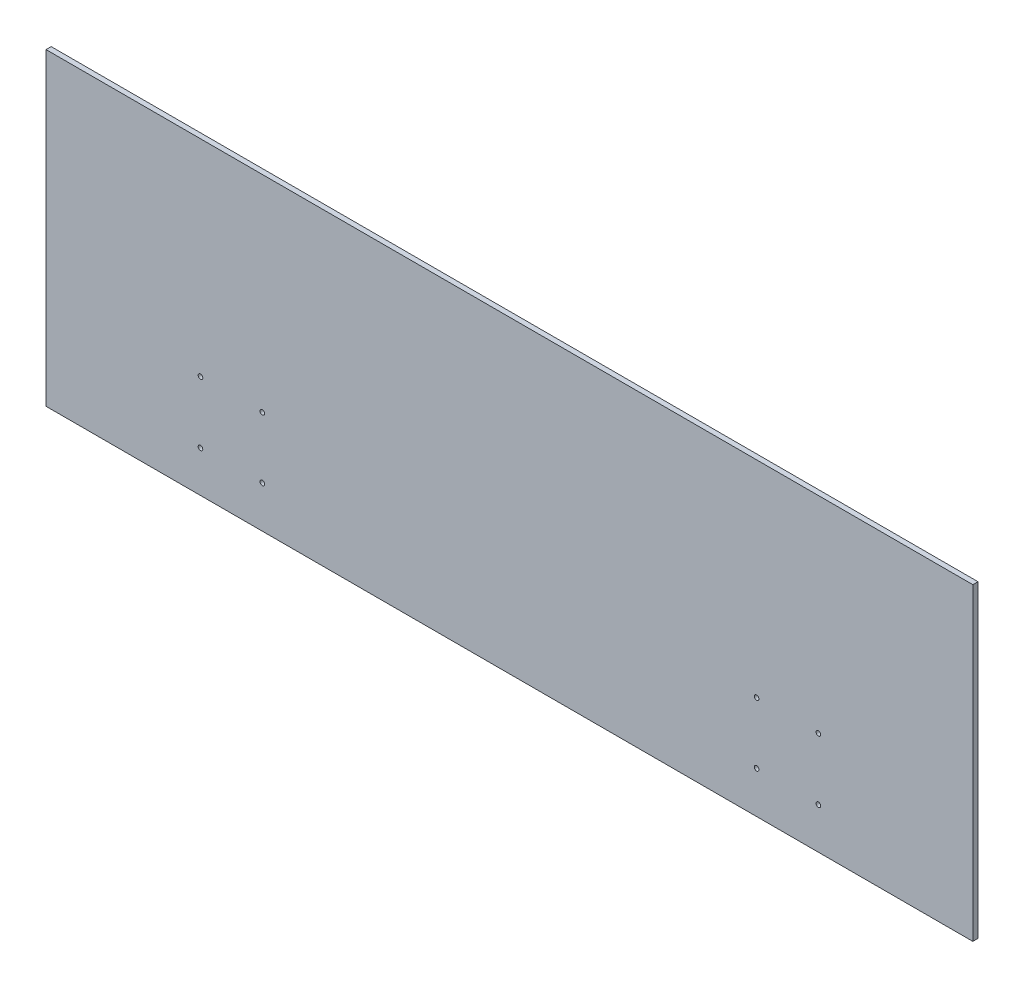
ISO-10303-21;
HEADER;
FILE_DESCRIPTION(('STEP AP214'),'2;1');
FILE_NAME('part.step','',(''),(''),'','','');
FILE_SCHEMA(('AUTOMOTIVE_DESIGN { 1 0 10303 214 1 1 1 1 }'));
ENDSEC;
DATA;
#1=APPLICATION_CONTEXT('core data for automotive mechanical design processes');
#2=APPLICATION_PROTOCOL_DEFINITION('international standard','automotive_design',2000,#1);
#3=PRODUCT_CONTEXT('',#1,'mechanical');
#4=PRODUCT('Part','Part','',(#3));
#5=PRODUCT_RELATED_PRODUCT_CATEGORY('part','',(#4));
#6=PRODUCT_DEFINITION_FORMATION('','',#4);
#7=PRODUCT_DEFINITION_CONTEXT('part definition',#1,'design');
#8=PRODUCT_DEFINITION('design','',#6,#7);
#9=PRODUCT_DEFINITION_SHAPE('','',#8);
#10=(LENGTH_UNIT() NAMED_UNIT(*) SI_UNIT(.MILLI.,.METRE.));
#11=(NAMED_UNIT(*) PLANE_ANGLE_UNIT() SI_UNIT($,.RADIAN.));
#12=(NAMED_UNIT(*) SI_UNIT($,.STERADIAN.) SOLID_ANGLE_UNIT());
#13=UNCERTAINTY_MEASURE_WITH_UNIT(LENGTH_MEASURE(1.E-05),#10,'distance_accuracy_value','');
#14=(GEOMETRIC_REPRESENTATION_CONTEXT(3) GLOBAL_UNCERTAINTY_ASSIGNED_CONTEXT((#13)) GLOBAL_UNIT_ASSIGNED_CONTEXT((#10,
#11,#12)) REPRESENTATION_CONTEXT('',''));
#15=CARTESIAN_POINT('',(0.,0.,0.));
#16=DIRECTION('',(0.,0.,1.));
#17=DIRECTION('',(1.,0.,0.));
#18=AXIS2_PLACEMENT_3D('',#15,#16,#17);
#19=CARTESIAN_POINT('',(0.,0.,5.));
#20=DIRECTION('',(0.,0.,1.));
#21=DIRECTION('',(1.,0.,0.));
#22=AXIS2_PLACEMENT_3D('',#19,#20,#21);
#23=PLANE('',#22);
#24=CARTESIAN_POINT('',(393.736654804271,-7.02846975088967,5.));
#25=DIRECTION('',(0.,0.,1.));
#26=DIRECTION('',(-1.,0.,0.));
#27=AXIS2_PLACEMENT_3D('',#24,#25,#26);
#28=CIRCLE('',#27,2.25000000000001);
#29=CARTESIAN_POINT('',(391.486654804271,-7.02846975088967,5.));
#30=VERTEX_POINT('',#29);
#31=EDGE_CURVE('E148',#30,#30,#28,.T.);
#32=ORIENTED_EDGE('',*,*,#31,.F.);
#33=EDGE_LOOP('',(#32));
#34=FACE_BOUND('',#33,.T.);
#35=CARTESIAN_POINT('',(453.736654804271,-67.0284697508897,5.));
#36=DIRECTION('',(0.,0.,1.));
#37=DIRECTION('',(-1.,0.,0.));
#38=AXIS2_PLACEMENT_3D('',#35,#36,#37);
#39=CIRCLE('',#38,2.25000000000001);
#40=CARTESIAN_POINT('',(451.486654804271,-67.0284697508897,5.));
#41=VERTEX_POINT('',#40);
#42=EDGE_CURVE('E136',#41,#41,#39,.T.);
#43=ORIENTED_EDGE('',*,*,#42,.F.);
#44=EDGE_LOOP('',(#43));
#45=FACE_BOUND('',#44,.T.);
#46=CARTESIAN_POINT('',(-86.2633451957295,-66.459074733096,5.));
#47=DIRECTION('',(0.,0.,1.));
#48=DIRECTION('',(1.,0.,0.));
#49=AXIS2_PLACEMENT_3D('',#46,#47,#48);
#50=CIRCLE('',#49,2.25000000000001);
#51=CARTESIAN_POINT('',(-84.0133451957295,-66.459074733096,5.));
#52=VERTEX_POINT('',#51);
#53=EDGE_CURVE('E124',#52,#52,#50,.T.);
#54=ORIENTED_EDGE('',*,*,#53,.F.);
#55=EDGE_LOOP('',(#54));
#56=FACE_BOUND('',#55,.T.);
#57=CARTESIAN_POINT('',(-146.263345195729,-7.02846975088967,5.));
#58=DIRECTION('',(0.,0.,1.));
#59=DIRECTION('',(1.,0.,0.));
#60=AXIS2_PLACEMENT_3D('',#57,#58,#59);
#61=CIRCLE('',#60,2.25000000000001);
#62=CARTESIAN_POINT('',(-144.013345195729,-7.02846975088967,5.));
#63=VERTEX_POINT('',#62);
#64=EDGE_CURVE('E103',#63,#63,#61,.T.);
#65=ORIENTED_EDGE('',*,*,#64,.F.);
#66=EDGE_LOOP('',(#65));
#67=FACE_BOUND('',#66,.T.);
#68=DIRECTION('',(0.,-1.,0.));
#69=VECTOR('',#68,1.);
#70=CARTESIAN_POINT('',(-296.26334519573,192.97153024911,5.));
#71=LINE('',#70,#69);
#72=CARTESIAN_POINT('',(-296.26334519573,192.97153024911,5.));
#73=VERTEX_POINT('',#72);
#74=CARTESIAN_POINT('',(-296.263345195729,-107.02846975089,5.));
#75=VERTEX_POINT('',#74);
#76=EDGE_CURVE('E88',#73,#75,#71,.T.);
#77=ORIENTED_EDGE('',*,*,#76,.T.);
#78=DIRECTION('',(1.,0.,0.));
#79=VECTOR('',#78,1.);
#80=CARTESIAN_POINT('',(-296.263345195729,-107.02846975089,5.));
#81=LINE('',#80,#79);
#82=CARTESIAN_POINT('',(603.736654804271,-107.02846975089,5.));
#83=VERTEX_POINT('',#82);
#84=EDGE_CURVE('E83',#75,#83,#81,.T.);
#85=ORIENTED_EDGE('',*,*,#84,.T.);
#86=DIRECTION('',(0.,1.,0.));
#87=VECTOR('',#86,1.);
#88=CARTESIAN_POINT('',(603.736654804271,192.97153024911,5.));
#89=LINE('',#88,#87);
#90=CARTESIAN_POINT('',(603.736654804271,192.97153024911,5.));
#91=VERTEX_POINT('',#90);
#92=EDGE_CURVE('E86',#83,#91,#89,.T.);
#93=ORIENTED_EDGE('',*,*,#92,.T.);
#94=DIRECTION('',(-1.,0.,0.));
#95=VECTOR('',#94,1.);
#96=CARTESIAN_POINT('',(-296.26334519573,192.97153024911,5.));
#97=LINE('',#96,#95);
#98=EDGE_CURVE('E53',#91,#73,#97,.T.);
#99=ORIENTED_EDGE('',*,*,#98,.T.);
#100=EDGE_LOOP('',(#77,#85,#93,#99));
#101=FACE_BOUND('',#100,.T.);
#102=CARTESIAN_POINT('',(-86.2633451957295,-7.02846975088967,5.));
#103=DIRECTION('',(0.,0.,1.));
#104=DIRECTION('',(1.,0.,0.));
#105=AXIS2_PLACEMENT_3D('',#102,#103,#104);
#106=CIRCLE('',#105,2.25000000000001);
#107=CARTESIAN_POINT('',(-84.0133451957295,-7.02846975088967,5.));
#108=VERTEX_POINT('',#107);
#109=EDGE_CURVE('E118',#108,#108,#106,.T.);
#110=ORIENTED_EDGE('',*,*,#109,.F.);
#111=EDGE_LOOP('',(#110));
#112=FACE_BOUND('',#111,.T.);
#113=CARTESIAN_POINT('',(-146.263345195729,-67.0284697508897,5.));
#114=DIRECTION('',(0.,0.,1.));
#115=DIRECTION('',(1.,0.,0.));
#116=AXIS2_PLACEMENT_3D('',#113,#114,#115);
#117=CIRCLE('',#116,2.25000000000001);
#118=CARTESIAN_POINT('',(-144.013345195729,-67.0284697508897,5.));
#119=VERTEX_POINT('',#118);
#120=EDGE_CURVE('E130',#119,#119,#117,.T.);
#121=ORIENTED_EDGE('',*,*,#120,.F.);
#122=EDGE_LOOP('',(#121));
#123=FACE_BOUND('',#122,.T.);
#124=CARTESIAN_POINT('',(393.736654804271,-66.459074733096,5.));
#125=DIRECTION('',(0.,0.,1.));
#126=DIRECTION('',(-1.,0.,0.));
#127=AXIS2_PLACEMENT_3D('',#124,#125,#126);
#128=CIRCLE('',#127,2.25000000000001);
#129=CARTESIAN_POINT('',(391.486654804271,-66.459074733096,5.));
#130=VERTEX_POINT('',#129);
#131=EDGE_CURVE('E142',#130,#130,#128,.T.);
#132=ORIENTED_EDGE('',*,*,#131,.F.);
#133=EDGE_LOOP('',(#132));
#134=FACE_BOUND('',#133,.T.);
#135=CARTESIAN_POINT('',(453.736654804271,-7.02846975088967,5.));
#136=DIRECTION('',(0.,0.,1.));
#137=DIRECTION('',(-1.,0.,0.));
#138=AXIS2_PLACEMENT_3D('',#135,#136,#137);
#139=CIRCLE('',#138,2.25000000000001);
#140=CARTESIAN_POINT('',(451.486654804271,-7.02846975088967,5.));
#141=VERTEX_POINT('',#140);
#142=EDGE_CURVE('E154',#141,#141,#139,.T.);
#143=ORIENTED_EDGE('',*,*,#142,.F.);
#144=EDGE_LOOP('',(#143));
#145=FACE_BOUND('',#144,.T.);
#146=ADVANCED_FACE('F36',(#34,#45,#56,#67,#101,#112,#123,#134,#145),#23,.T.);
#147=CARTESIAN_POINT('',(0.,0.,0.));
#148=DIRECTION('',(0.,0.,1.));
#149=DIRECTION('',(1.,0.,0.));
#150=AXIS2_PLACEMENT_3D('',#147,#148,#149);
#151=PLANE('',#150);
#152=DIRECTION('',(0.,-1.,0.));
#153=VECTOR('',#152,1.);
#154=CARTESIAN_POINT('',(-296.26334519573,192.97153024911,0.));
#155=LINE('',#154,#153);
#156=CARTESIAN_POINT('',(-296.26334519573,192.97153024911,0.));
#157=VERTEX_POINT('',#156);
#158=CARTESIAN_POINT('',(-296.263345195729,-107.02846975089,0.));
#159=VERTEX_POINT('',#158);
#160=EDGE_CURVE('E100',#157,#159,#155,.T.);
#161=ORIENTED_EDGE('',*,*,#160,.F.);
#162=DIRECTION('',(-1.,0.,0.));
#163=VECTOR('',#162,1.);
#164=CARTESIAN_POINT('',(-296.26334519573,192.97153024911,0.));
#165=LINE('',#164,#163);
#166=CARTESIAN_POINT('',(603.736654804271,192.97153024911,0.));
#167=VERTEX_POINT('',#166);
#168=EDGE_CURVE('E76',#167,#157,#165,.T.);
#169=ORIENTED_EDGE('',*,*,#168,.F.);
#170=DIRECTION('',(0.,1.,0.));
#171=VECTOR('',#170,1.);
#172=CARTESIAN_POINT('',(603.736654804271,192.97153024911,0.));
#173=LINE('',#172,#171);
#174=CARTESIAN_POINT('',(603.736654804271,-107.02846975089,0.));
#175=VERTEX_POINT('',#174);
#176=EDGE_CURVE('E70',#175,#167,#173,.T.);
#177=ORIENTED_EDGE('',*,*,#176,.F.);
#178=DIRECTION('',(1.,0.,0.));
#179=VECTOR('',#178,1.);
#180=CARTESIAN_POINT('',(-296.263345195729,-107.02846975089,0.));
#181=LINE('',#180,#179);
#182=EDGE_CURVE('E92',#159,#175,#181,.T.);
#183=ORIENTED_EDGE('',*,*,#182,.F.);
#184=EDGE_LOOP('',(#161,#169,#177,#183));
#185=FACE_BOUND('',#184,.T.);
#186=CARTESIAN_POINT('',(-146.263345195729,-7.02846975088967,0.));
#187=DIRECTION('',(0.,0.,1.));
#188=DIRECTION('',(1.,0.,0.));
#189=AXIS2_PLACEMENT_3D('',#186,#187,#188);
#190=CIRCLE('',#189,2.25000000000001);
#191=CARTESIAN_POINT('',(-144.013345195729,-7.02846975088967,0.));
#192=VERTEX_POINT('',#191);
#193=EDGE_CURVE('E115',#192,#192,#190,.T.);
#194=ORIENTED_EDGE('',*,*,#193,.T.);
#195=EDGE_LOOP('',(#194));
#196=FACE_BOUND('',#195,.T.);
#197=CARTESIAN_POINT('',(-86.2633451957295,-7.02846975088967,0.));
#198=DIRECTION('',(0.,0.,1.));
#199=DIRECTION('',(1.,0.,0.));
#200=AXIS2_PLACEMENT_3D('',#197,#198,#199);
#201=CIRCLE('',#200,2.25000000000001);
#202=CARTESIAN_POINT('',(-84.0133451957295,-7.02846975088967,0.));
#203=VERTEX_POINT('',#202);
#204=EDGE_CURVE('E121',#203,#203,#201,.T.);
#205=ORIENTED_EDGE('',*,*,#204,.T.);
#206=EDGE_LOOP('',(#205));
#207=FACE_BOUND('',#206,.T.);
#208=CARTESIAN_POINT('',(-86.2633451957295,-66.459074733096,0.));
#209=DIRECTION('',(0.,0.,1.));
#210=DIRECTION('',(1.,0.,0.));
#211=AXIS2_PLACEMENT_3D('',#208,#209,#210);
#212=CIRCLE('',#211,2.25000000000001);
#213=CARTESIAN_POINT('',(-84.0133451957295,-66.459074733096,0.));
#214=VERTEX_POINT('',#213);
#215=EDGE_CURVE('E127',#214,#214,#212,.T.);
#216=ORIENTED_EDGE('',*,*,#215,.T.);
#217=EDGE_LOOP('',(#216));
#218=FACE_BOUND('',#217,.T.);
#219=CARTESIAN_POINT('',(-146.263345195729,-67.0284697508897,0.));
#220=DIRECTION('',(0.,0.,1.));
#221=DIRECTION('',(1.,0.,0.));
#222=AXIS2_PLACEMENT_3D('',#219,#220,#221);
#223=CIRCLE('',#222,2.25000000000001);
#224=CARTESIAN_POINT('',(-144.013345195729,-67.0284697508897,0.));
#225=VERTEX_POINT('',#224);
#226=EDGE_CURVE('E133',#225,#225,#223,.T.);
#227=ORIENTED_EDGE('',*,*,#226,.T.);
#228=EDGE_LOOP('',(#227));
#229=FACE_BOUND('',#228,.T.);
#230=CARTESIAN_POINT('',(453.736654804271,-67.0284697508897,0.));
#231=DIRECTION('',(0.,0.,1.));
#232=DIRECTION('',(-1.,0.,0.));
#233=AXIS2_PLACEMENT_3D('',#230,#231,#232);
#234=CIRCLE('',#233,2.25000000000001);
#235=CARTESIAN_POINT('',(451.486654804271,-67.0284697508897,0.));
#236=VERTEX_POINT('',#235);
#237=EDGE_CURVE('E139',#236,#236,#234,.T.);
#238=ORIENTED_EDGE('',*,*,#237,.T.);
#239=EDGE_LOOP('',(#238));
#240=FACE_BOUND('',#239,.T.);
#241=CARTESIAN_POINT('',(393.736654804271,-66.459074733096,0.));
#242=DIRECTION('',(0.,0.,1.));
#243=DIRECTION('',(-1.,0.,0.));
#244=AXIS2_PLACEMENT_3D('',#241,#242,#243);
#245=CIRCLE('',#244,2.25000000000001);
#246=CARTESIAN_POINT('',(391.486654804271,-66.459074733096,0.));
#247=VERTEX_POINT('',#246);
#248=EDGE_CURVE('E145',#247,#247,#245,.T.);
#249=ORIENTED_EDGE('',*,*,#248,.T.);
#250=EDGE_LOOP('',(#249));
#251=FACE_BOUND('',#250,.T.);
#252=CARTESIAN_POINT('',(393.736654804271,-7.02846975088967,0.));
#253=DIRECTION('',(0.,0.,1.));
#254=DIRECTION('',(-1.,0.,0.));
#255=AXIS2_PLACEMENT_3D('',#252,#253,#254);
#256=CIRCLE('',#255,2.25000000000001);
#257=CARTESIAN_POINT('',(391.486654804271,-7.02846975088967,0.));
#258=VERTEX_POINT('',#257);
#259=EDGE_CURVE('E151',#258,#258,#256,.T.);
#260=ORIENTED_EDGE('',*,*,#259,.T.);
#261=EDGE_LOOP('',(#260));
#262=FACE_BOUND('',#261,.T.);
#263=CARTESIAN_POINT('',(453.736654804271,-7.02846975088967,0.));
#264=DIRECTION('',(0.,0.,1.));
#265=DIRECTION('',(-1.,0.,0.));
#266=AXIS2_PLACEMENT_3D('',#263,#264,#265);
#267=CIRCLE('',#266,2.25000000000001);
#268=CARTESIAN_POINT('',(451.486654804271,-7.02846975088967,0.));
#269=VERTEX_POINT('',#268);
#270=EDGE_CURVE('E157',#269,#269,#267,.T.);
#271=ORIENTED_EDGE('',*,*,#270,.T.);
#272=EDGE_LOOP('',(#271));
#273=FACE_BOUND('',#272,.T.);
#274=ADVANCED_FACE('F111',(#185,#196,#207,#218,#229,#240,#251,#262,#273),#151,.F.);
#275=CARTESIAN_POINT('',(-296.26334519573,192.97153024911,5.));
#276=DIRECTION('',(1.,0.,0.));
#277=DIRECTION('',(0.,1.,0.));
#278=AXIS2_PLACEMENT_3D('',#275,#276,#277);
#279=PLANE('',#278);
#280=ORIENTED_EDGE('',*,*,#160,.T.);
#281=DIRECTION('',(0.,0.,-1.));
#282=VECTOR('',#281,1.);
#283=CARTESIAN_POINT('',(-296.263345195729,-107.02846975089,5.));
#284=LINE('',#283,#282);
#285=EDGE_CURVE('E11',#75,#159,#284,.T.);
#286=ORIENTED_EDGE('',*,*,#285,.F.);
#287=ORIENTED_EDGE('',*,*,#76,.F.);
#288=DIRECTION('',(0.,0.,-1.));
#289=VECTOR('',#288,1.);
#290=CARTESIAN_POINT('',(-296.26334519573,192.97153024911,5.));
#291=LINE('',#290,#289);
#292=EDGE_CURVE('E96',#73,#157,#291,.T.);
#293=ORIENTED_EDGE('',*,*,#292,.T.);
#294=EDGE_LOOP('',(#280,#286,#287,#293));
#295=FACE_BOUND('',#294,.T.);
#296=ADVANCED_FACE('F38',(#295),#279,.F.);
#297=CARTESIAN_POINT('',(-296.263345195729,-107.02846975089,5.));
#298=DIRECTION('',(0.,1.,0.));
#299=DIRECTION('',(0.,0.,1.));
#300=AXIS2_PLACEMENT_3D('',#297,#298,#299);
#301=PLANE('',#300);
#302=ORIENTED_EDGE('',*,*,#182,.T.);
#303=DIRECTION('',(0.,0.,-1.));
#304=VECTOR('',#303,1.);
#305=CARTESIAN_POINT('',(603.736654804271,-107.02846975089,5.));
#306=LINE('',#305,#304);
#307=EDGE_CURVE('E45',#83,#175,#306,.T.);
#308=ORIENTED_EDGE('',*,*,#307,.F.);
#309=ORIENTED_EDGE('',*,*,#84,.F.);
#310=ORIENTED_EDGE('',*,*,#285,.T.);
#311=EDGE_LOOP('',(#302,#308,#309,#310));
#312=FACE_BOUND('',#311,.T.);
#313=ADVANCED_FACE('F91',(#312),#301,.F.);
#314=CARTESIAN_POINT('',(603.736654804271,192.97153024911,5.));
#315=DIRECTION('',(-1.,0.,0.));
#316=DIRECTION('',(0.,0.,1.));
#317=AXIS2_PLACEMENT_3D('',#314,#315,#316);
#318=PLANE('',#317);
#319=ORIENTED_EDGE('',*,*,#176,.T.);
#320=DIRECTION('',(0.,0.,-1.));
#321=VECTOR('',#320,1.);
#322=CARTESIAN_POINT('',(603.736654804271,192.97153024911,5.));
#323=LINE('',#322,#321);
#324=EDGE_CURVE('E93',#91,#167,#323,.T.);
#325=ORIENTED_EDGE('',*,*,#324,.F.);
#326=ORIENTED_EDGE('',*,*,#92,.F.);
#327=ORIENTED_EDGE('',*,*,#307,.T.);
#328=EDGE_LOOP('',(#319,#325,#326,#327));
#329=FACE_BOUND('',#328,.T.);
#330=ADVANCED_FACE('F94',(#329),#318,.F.);
#331=CARTESIAN_POINT('',(-296.26334519573,192.97153024911,5.));
#332=DIRECTION('',(0.,-1.,0.));
#333=DIRECTION('',(0.,0.,-1.));
#334=AXIS2_PLACEMENT_3D('',#331,#332,#333);
#335=PLANE('',#334);
#336=ORIENTED_EDGE('',*,*,#168,.T.);
#337=ORIENTED_EDGE('',*,*,#292,.F.);
#338=ORIENTED_EDGE('',*,*,#98,.F.);
#339=ORIENTED_EDGE('',*,*,#324,.T.);
#340=EDGE_LOOP('',(#336,#337,#338,#339));
#341=FACE_BOUND('',#340,.T.);
#342=ADVANCED_FACE('F108',(#341),#335,.F.);
#343=CARTESIAN_POINT('',(-146.263345195729,-7.02846975088967,5.));
#344=DIRECTION('',(0.,0.,-1.));
#345=DIRECTION('',(-1.,0.,0.));
#346=AXIS2_PLACEMENT_3D('',#343,#344,#345);
#347=CYLINDRICAL_SURFACE('',#346,2.25000000000001);
#348=ORIENTED_EDGE('',*,*,#64,.T.);
#349=EDGE_LOOP('',(#348));
#350=FACE_BOUND('',#349,.T.);
#351=ORIENTED_EDGE('',*,*,#193,.F.);
#352=EDGE_LOOP('',(#351));
#353=FACE_BOUND('',#352,.T.);
#354=ADVANCED_FACE('F176',(#350,#353),#347,.F.);
#355=CARTESIAN_POINT('',(-86.2633451957295,-7.02846975088967,5.));
#356=DIRECTION('',(0.,0.,-1.));
#357=DIRECTION('',(-1.,0.,0.));
#358=AXIS2_PLACEMENT_3D('',#355,#356,#357);
#359=CYLINDRICAL_SURFACE('',#358,2.25000000000001);
#360=ORIENTED_EDGE('',*,*,#109,.T.);
#361=EDGE_LOOP('',(#360));
#362=FACE_BOUND('',#361,.T.);
#363=ORIENTED_EDGE('',*,*,#204,.F.);
#364=EDGE_LOOP('',(#363));
#365=FACE_BOUND('',#364,.T.);
#366=ADVANCED_FACE('F230',(#362,#365),#359,.F.);
#367=CARTESIAN_POINT('',(-86.2633451957295,-66.459074733096,5.));
#368=DIRECTION('',(0.,0.,-1.));
#369=DIRECTION('',(-1.,0.,0.));
#370=AXIS2_PLACEMENT_3D('',#367,#368,#369);
#371=CYLINDRICAL_SURFACE('',#370,2.25000000000001);
#372=ORIENTED_EDGE('',*,*,#53,.T.);
#373=EDGE_LOOP('',(#372));
#374=FACE_BOUND('',#373,.T.);
#375=ORIENTED_EDGE('',*,*,#215,.F.);
#376=EDGE_LOOP('',(#375));
#377=FACE_BOUND('',#376,.T.);
#378=ADVANCED_FACE('F239',(#374,#377),#371,.F.);
#379=CARTESIAN_POINT('',(-146.263345195729,-67.0284697508897,5.));
#380=DIRECTION('',(0.,0.,-1.));
#381=DIRECTION('',(-1.,0.,0.));
#382=AXIS2_PLACEMENT_3D('',#379,#380,#381);
#383=CYLINDRICAL_SURFACE('',#382,2.25000000000001);
#384=ORIENTED_EDGE('',*,*,#120,.T.);
#385=EDGE_LOOP('',(#384));
#386=FACE_BOUND('',#385,.T.);
#387=ORIENTED_EDGE('',*,*,#226,.F.);
#388=EDGE_LOOP('',(#387));
#389=FACE_BOUND('',#388,.T.);
#390=ADVANCED_FACE('F248',(#386,#389),#383,.F.);
#391=CARTESIAN_POINT('',(453.736654804271,-67.0284697508897,5.));
#392=DIRECTION('',(0.,0.,-1.));
#393=DIRECTION('',(-1.,0.,0.));
#394=AXIS2_PLACEMENT_3D('',#391,#392,#393);
#395=CYLINDRICAL_SURFACE('',#394,2.25000000000001);
#396=ORIENTED_EDGE('',*,*,#42,.T.);
#397=EDGE_LOOP('',(#396));
#398=FACE_BOUND('',#397,.T.);
#399=ORIENTED_EDGE('',*,*,#237,.F.);
#400=EDGE_LOOP('',(#399));
#401=FACE_BOUND('',#400,.T.);
#402=ADVANCED_FACE('F258',(#398,#401),#395,.F.);
#403=CARTESIAN_POINT('',(393.736654804271,-66.459074733096,5.));
#404=DIRECTION('',(0.,0.,-1.));
#405=DIRECTION('',(-1.,0.,0.));
#406=AXIS2_PLACEMENT_3D('',#403,#404,#405);
#407=CYLINDRICAL_SURFACE('',#406,2.25000000000001);
#408=ORIENTED_EDGE('',*,*,#131,.T.);
#409=EDGE_LOOP('',(#408));
#410=FACE_BOUND('',#409,.T.);
#411=ORIENTED_EDGE('',*,*,#248,.F.);
#412=EDGE_LOOP('',(#411));
#413=FACE_BOUND('',#412,.T.);
#414=ADVANCED_FACE('F268',(#410,#413),#407,.F.);
#415=CARTESIAN_POINT('',(393.736654804271,-7.02846975088967,5.));
#416=DIRECTION('',(0.,0.,-1.));
#417=DIRECTION('',(-1.,0.,0.));
#418=AXIS2_PLACEMENT_3D('',#415,#416,#417);
#419=CYLINDRICAL_SURFACE('',#418,2.25000000000001);
#420=ORIENTED_EDGE('',*,*,#31,.T.);
#421=EDGE_LOOP('',(#420));
#422=FACE_BOUND('',#421,.T.);
#423=ORIENTED_EDGE('',*,*,#259,.F.);
#424=EDGE_LOOP('',(#423));
#425=FACE_BOUND('',#424,.T.);
#426=ADVANCED_FACE('F278',(#422,#425),#419,.F.);
#427=CARTESIAN_POINT('',(453.736654804271,-7.02846975088967,5.));
#428=DIRECTION('',(0.,0.,-1.));
#429=DIRECTION('',(-1.,0.,0.));
#430=AXIS2_PLACEMENT_3D('',#427,#428,#429);
#431=CYLINDRICAL_SURFACE('',#430,2.25000000000001);
#432=ORIENTED_EDGE('',*,*,#142,.T.);
#433=EDGE_LOOP('',(#432));
#434=FACE_BOUND('',#433,.T.);
#435=ORIENTED_EDGE('',*,*,#270,.F.);
#436=EDGE_LOOP('',(#435));
#437=FACE_BOUND('',#436,.T.);
#438=ADVANCED_FACE('F163',(#434,#437),#431,.F.);
#439=CLOSED_SHELL('',(#146,#274,#296,#313,#330,#342,#354,#366,#378,#390,#402,#414,#426,#438));
#440=MANIFOLD_SOLID_BREP('B2',#439);
#441=ADVANCED_BREP_SHAPE_REPRESENTATION('',(#18,#440),#14);
#442=SHAPE_DEFINITION_REPRESENTATION(#9,#441);
ENDSEC;
END-ISO-10303-21;
